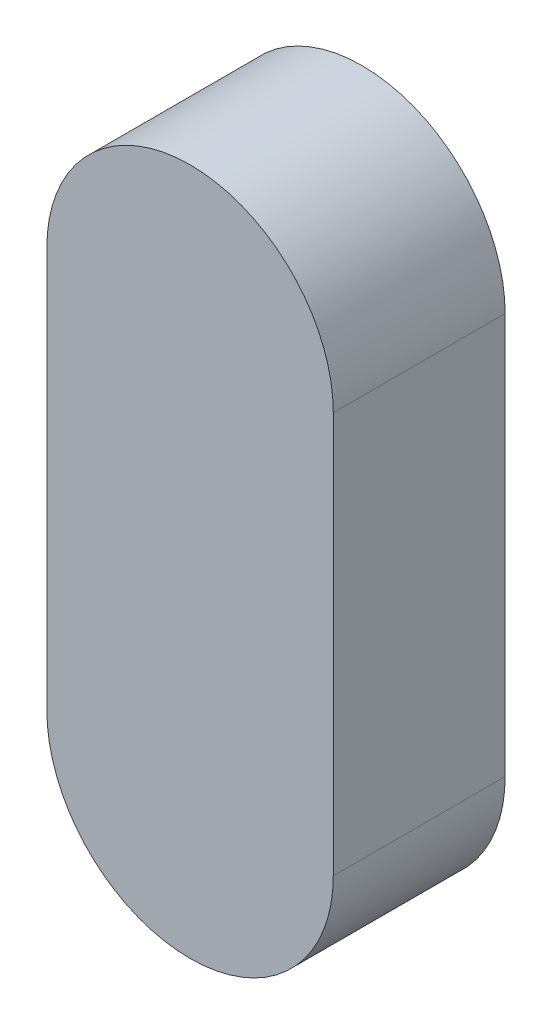
ISO-10303-21;
HEADER;
FILE_DESCRIPTION(('STEP AP214'),'2;1');
FILE_NAME('part.step','',(''),(''),'','','');
FILE_SCHEMA(('AUTOMOTIVE_DESIGN { 1 0 10303 214 1 1 1 1 }'));
ENDSEC;
DATA;
#1=APPLICATION_CONTEXT('core data for automotive mechanical design processes');
#2=APPLICATION_PROTOCOL_DEFINITION('international standard','automotive_design',2000,#1);
#3=PRODUCT_CONTEXT('',#1,'mechanical');
#4=PRODUCT('Part','Part','',(#3));
#5=PRODUCT_RELATED_PRODUCT_CATEGORY('part','',(#4));
#6=PRODUCT_DEFINITION_FORMATION('','',#4);
#7=PRODUCT_DEFINITION_CONTEXT('part definition',#1,'design');
#8=PRODUCT_DEFINITION('design','',#6,#7);
#9=PRODUCT_DEFINITION_SHAPE('','',#8);
#10=(LENGTH_UNIT() NAMED_UNIT(*) SI_UNIT(.MILLI.,.METRE.));
#11=(NAMED_UNIT(*) PLANE_ANGLE_UNIT() SI_UNIT($,.RADIAN.));
#12=(NAMED_UNIT(*) SI_UNIT($,.STERADIAN.) SOLID_ANGLE_UNIT());
#13=UNCERTAINTY_MEASURE_WITH_UNIT(LENGTH_MEASURE(1.E-05),#10,'distance_accuracy_value','');
#14=(GEOMETRIC_REPRESENTATION_CONTEXT(3) GLOBAL_UNCERTAINTY_ASSIGNED_CONTEXT((#13)) GLOBAL_UNIT_ASSIGNED_CONTEXT((#10,
#11,#12)) REPRESENTATION_CONTEXT('',''));
#15=CARTESIAN_POINT('',(0.,0.,0.));
#16=DIRECTION('',(0.,0.,1.));
#17=DIRECTION('',(1.,0.,0.));
#18=AXIS2_PLACEMENT_3D('',#15,#16,#17);
#19=CARTESIAN_POINT('',(0.,-3.5,3.));
#20=DIRECTION('',(0.,0.,-1.));
#21=DIRECTION('',(-1.,0.,0.));
#22=AXIS2_PLACEMENT_3D('',#19,#20,#21);
#23=CYLINDRICAL_SURFACE('',#22,2.5);
#24=CARTESIAN_POINT('',(0.,-3.5,0.));
#25=DIRECTION('',(0.,0.,1.));
#26=DIRECTION('',(1.,0.,0.));
#27=AXIS2_PLACEMENT_3D('',#24,#25,#26);
#28=CIRCLE('',#27,2.5);
#29=CARTESIAN_POINT('',(-2.5,-3.5,0.));
#30=VERTEX_POINT('',#29);
#31=CARTESIAN_POINT('',(2.5,-3.5,0.));
#32=VERTEX_POINT('',#31);
#33=EDGE_CURVE('E108',#30,#32,#28,.T.);
#34=ORIENTED_EDGE('',*,*,#33,.T.);
#35=DIRECTION('',(0.,0.,-1.));
#36=VECTOR('',#35,1.);
#37=CARTESIAN_POINT('',(2.5,-3.5,3.));
#38=LINE('',#37,#36);
#39=CARTESIAN_POINT('',(2.5,-3.5,3.));
#40=VERTEX_POINT('',#39);
#41=EDGE_CURVE('E13',#40,#32,#38,.T.);
#42=ORIENTED_EDGE('',*,*,#41,.F.);
#43=CARTESIAN_POINT('',(0.,-3.5,3.));
#44=DIRECTION('',(0.,0.,1.));
#45=DIRECTION('',(1.,0.,0.));
#46=AXIS2_PLACEMENT_3D('',#43,#44,#45);
#47=CIRCLE('',#46,2.5);
#48=CARTESIAN_POINT('',(-2.5,-3.5,3.));
#49=VERTEX_POINT('',#48);
#50=EDGE_CURVE('E96',#49,#40,#47,.T.);
#51=ORIENTED_EDGE('',*,*,#50,.F.);
#52=DIRECTION('',(0.,0.,-1.));
#53=VECTOR('',#52,1.);
#54=CARTESIAN_POINT('',(-2.5,-3.5,3.));
#55=LINE('',#54,#53);
#56=EDGE_CURVE('E104',#49,#30,#55,.T.);
#57=ORIENTED_EDGE('',*,*,#56,.T.);
#58=EDGE_LOOP('',(#34,#42,#51,#57));
#59=FACE_BOUND('',#58,.T.);
#60=ADVANCED_FACE('F45',(#59),#23,.T.);
#61=CARTESIAN_POINT('',(2.5,-3.5,3.));
#62=DIRECTION('',(-1.,0.,0.));
#63=DIRECTION('',(0.,-1.,0.));
#64=AXIS2_PLACEMENT_3D('',#61,#62,#63);
#65=PLANE('',#64);
#66=DIRECTION('',(0.,1.,0.));
#67=VECTOR('',#66,1.);
#68=CARTESIAN_POINT('',(2.5,-3.5,0.));
#69=LINE('',#68,#67);
#70=CARTESIAN_POINT('',(2.5,3.5,0.));
#71=VERTEX_POINT('',#70);
#72=EDGE_CURVE('E100',#32,#71,#69,.T.);
#73=ORIENTED_EDGE('',*,*,#72,.T.);
#74=DIRECTION('',(0.,0.,-1.));
#75=VECTOR('',#74,1.);
#76=CARTESIAN_POINT('',(2.5,3.5,3.));
#77=LINE('',#76,#75);
#78=CARTESIAN_POINT('',(2.5,3.5,3.));
#79=VERTEX_POINT('',#78);
#80=EDGE_CURVE('E53',#79,#71,#77,.T.);
#81=ORIENTED_EDGE('',*,*,#80,.F.);
#82=DIRECTION('',(0.,1.,0.));
#83=VECTOR('',#82,1.);
#84=CARTESIAN_POINT('',(2.5,-3.5,3.));
#85=LINE('',#84,#83);
#86=EDGE_CURVE('E91',#40,#79,#85,.T.);
#87=ORIENTED_EDGE('',*,*,#86,.F.);
#88=ORIENTED_EDGE('',*,*,#41,.T.);
#89=EDGE_LOOP('',(#73,#81,#87,#88));
#90=FACE_BOUND('',#89,.T.);
#91=ADVANCED_FACE('F99',(#90),#65,.F.);
#92=CARTESIAN_POINT('',(0.,3.5,3.));
#93=DIRECTION('',(0.,0.,-1.));
#94=DIRECTION('',(-1.,0.,0.));
#95=AXIS2_PLACEMENT_3D('',#92,#93,#94);
#96=CYLINDRICAL_SURFACE('',#95,2.5);
#97=CARTESIAN_POINT('',(0.,3.5,0.));
#98=DIRECTION('',(0.,0.,1.));
#99=DIRECTION('',(1.,0.,0.));
#100=AXIS2_PLACEMENT_3D('',#97,#98,#99);
#101=CIRCLE('',#100,2.5);
#102=CARTESIAN_POINT('',(-2.5,3.5,0.));
#103=VERTEX_POINT('',#102);
#104=EDGE_CURVE('E78',#71,#103,#101,.T.);
#105=ORIENTED_EDGE('',*,*,#104,.T.);
#106=DIRECTION('',(0.,0.,-1.));
#107=VECTOR('',#106,1.);
#108=CARTESIAN_POINT('',(-2.5,3.5,3.));
#109=LINE('',#108,#107);
#110=CARTESIAN_POINT('',(-2.5,3.5,3.));
#111=VERTEX_POINT('',#110);
#112=EDGE_CURVE('E101',#111,#103,#109,.T.);
#113=ORIENTED_EDGE('',*,*,#112,.F.);
#114=CARTESIAN_POINT('',(0.,3.5,3.));
#115=DIRECTION('',(0.,0.,1.));
#116=DIRECTION('',(1.,0.,0.));
#117=AXIS2_PLACEMENT_3D('',#114,#115,#116);
#118=CIRCLE('',#117,2.5);
#119=EDGE_CURVE('E94',#79,#111,#118,.T.);
#120=ORIENTED_EDGE('',*,*,#119,.F.);
#121=ORIENTED_EDGE('',*,*,#80,.T.);
#122=EDGE_LOOP('',(#105,#113,#120,#121));
#123=FACE_BOUND('',#122,.T.);
#124=ADVANCED_FACE('F102',(#123),#96,.T.);
#125=CARTESIAN_POINT('',(-2.5,-3.5,3.));
#126=DIRECTION('',(1.,0.,0.));
#127=DIRECTION('',(0.,1.,0.));
#128=AXIS2_PLACEMENT_3D('',#125,#126,#127);
#129=PLANE('',#128);
#130=DIRECTION('',(0.,-1.,0.));
#131=VECTOR('',#130,1.);
#132=CARTESIAN_POINT('',(-2.5,-3.5,0.));
#133=LINE('',#132,#131);
#134=EDGE_CURVE('E84',#103,#30,#133,.T.);
#135=ORIENTED_EDGE('',*,*,#134,.T.);
#136=ORIENTED_EDGE('',*,*,#56,.F.);
#137=DIRECTION('',(0.,-1.,0.));
#138=VECTOR('',#137,1.);
#139=CARTESIAN_POINT('',(-2.5,-3.5,3.));
#140=LINE('',#139,#138);
#141=EDGE_CURVE('E61',#111,#49,#140,.T.);
#142=ORIENTED_EDGE('',*,*,#141,.F.);
#143=ORIENTED_EDGE('',*,*,#112,.T.);
#144=EDGE_LOOP('',(#135,#136,#142,#143));
#145=FACE_BOUND('',#144,.T.);
#146=ADVANCED_FACE('F115',(#145),#129,.F.);
#147=CARTESIAN_POINT('',(0.,-3.5,3.));
#148=DIRECTION('',(0.,0.,1.));
#149=DIRECTION('',(1.,0.,0.));
#150=AXIS2_PLACEMENT_3D('',#147,#148,#149);
#151=PLANE('',#150);
#152=ORIENTED_EDGE('',*,*,#50,.T.);
#153=ORIENTED_EDGE('',*,*,#86,.T.);
#154=ORIENTED_EDGE('',*,*,#119,.T.);
#155=ORIENTED_EDGE('',*,*,#141,.T.);
#156=EDGE_LOOP('',(#152,#153,#154,#155));
#157=FACE_BOUND('',#156,.T.);
#158=ADVANCED_FACE('F92',(#157),#151,.T.);
#159=CARTESIAN_POINT('',(0.,-3.5,0.));
#160=DIRECTION('',(0.,0.,1.));
#161=DIRECTION('',(1.,0.,0.));
#162=AXIS2_PLACEMENT_3D('',#159,#160,#161);
#163=PLANE('',#162);
#164=ORIENTED_EDGE('',*,*,#33,.F.);
#165=ORIENTED_EDGE('',*,*,#134,.F.);
#166=ORIENTED_EDGE('',*,*,#104,.F.);
#167=ORIENTED_EDGE('',*,*,#72,.F.);
#168=EDGE_LOOP('',(#164,#165,#166,#167));
#169=FACE_BOUND('',#168,.T.);
#170=ADVANCED_FACE('F118',(#169),#163,.F.);
#171=CLOSED_SHELL('',(#60,#91,#124,#146,#158,#170));
#172=MANIFOLD_SOLID_BREP('B2',#171);
#173=ADVANCED_BREP_SHAPE_REPRESENTATION('',(#18,#172),#14);
#174=SHAPE_DEFINITION_REPRESENTATION(#9,#173);
ENDSEC;
END-ISO-10303-21;
